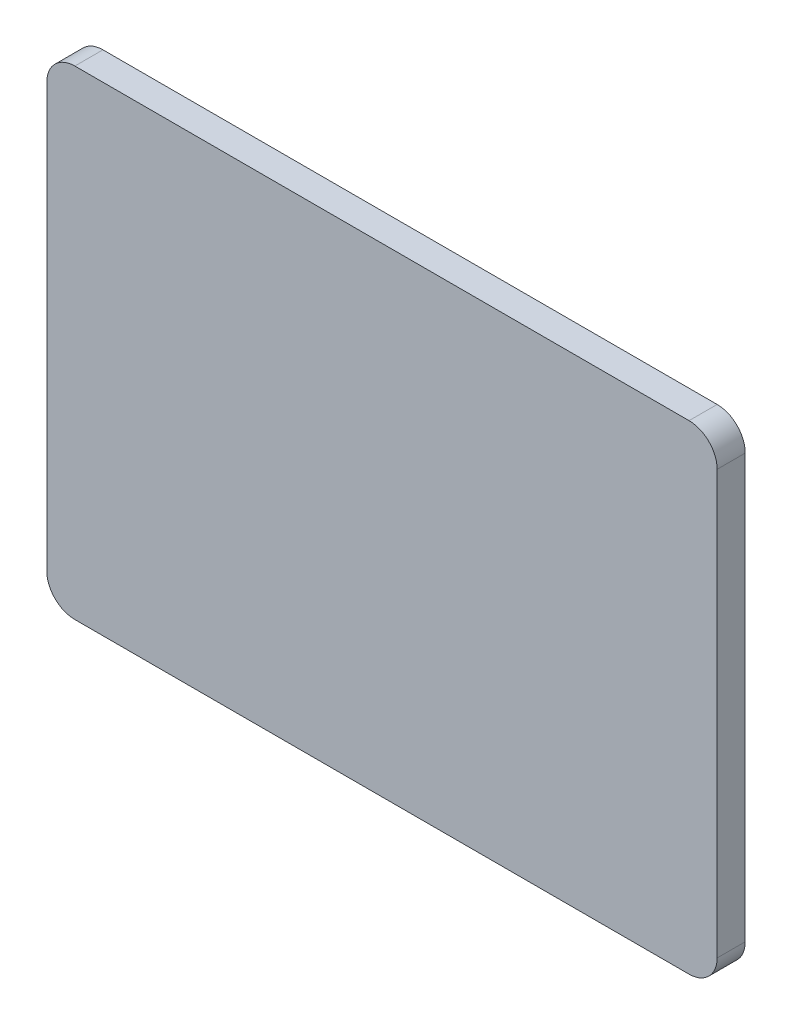
ISO-10303-21;
HEADER;
FILE_DESCRIPTION(('STEP AP214'),'2;1');
FILE_NAME('part.step','',(''),(''),'','','');
FILE_SCHEMA(('AUTOMOTIVE_DESIGN { 1 0 10303 214 1 1 1 1 }'));
ENDSEC;
DATA;
#1=APPLICATION_CONTEXT('core data for automotive mechanical design processes');
#2=APPLICATION_PROTOCOL_DEFINITION('international standard','automotive_design',2000,#1);
#3=PRODUCT_CONTEXT('',#1,'mechanical');
#4=PRODUCT('Part','Part','',(#3));
#5=PRODUCT_RELATED_PRODUCT_CATEGORY('part','',(#4));
#6=PRODUCT_DEFINITION_FORMATION('','',#4);
#7=PRODUCT_DEFINITION_CONTEXT('part definition',#1,'design');
#8=PRODUCT_DEFINITION('design','',#6,#7);
#9=PRODUCT_DEFINITION_SHAPE('','',#8);
#10=(LENGTH_UNIT() NAMED_UNIT(*) SI_UNIT(.MILLI.,.METRE.));
#11=(NAMED_UNIT(*) PLANE_ANGLE_UNIT() SI_UNIT($,.RADIAN.));
#12=(NAMED_UNIT(*) SI_UNIT($,.STERADIAN.) SOLID_ANGLE_UNIT());
#13=UNCERTAINTY_MEASURE_WITH_UNIT(LENGTH_MEASURE(1.E-05),#10,'distance_accuracy_value','');
#14=(GEOMETRIC_REPRESENTATION_CONTEXT(3) GLOBAL_UNCERTAINTY_ASSIGNED_CONTEXT((#13)) GLOBAL_UNIT_ASSIGNED_CONTEXT((#10,
#11,#12)) REPRESENTATION_CONTEXT('',''));
#15=CARTESIAN_POINT('',(0.,0.,0.));
#16=DIRECTION('',(0.,0.,1.));
#17=DIRECTION('',(1.,0.,0.));
#18=AXIS2_PLACEMENT_3D('',#15,#16,#17);
#19=CARTESIAN_POINT('',(0.,0.,15.));
#20=DIRECTION('',(1.,0.,0.));
#21=DIRECTION('',(0.,0.,-1.));
#22=AXIS2_PLACEMENT_3D('',#19,#20,#21);
#23=PLANE('',#22);
#24=DIRECTION('',(0.,-1.,0.));
#25=VECTOR('',#24,1.);
#26=CARTESIAN_POINT('',(0.,0.,0.));
#27=LINE('',#26,#25);
#28=CARTESIAN_POINT('',(0.,241.,0.));
#29=VERTEX_POINT('',#28);
#30=CARTESIAN_POINT('',(0.,15.,0.));
#31=VERTEX_POINT('',#30);
#32=EDGE_CURVE('E126',#29,#31,#27,.T.);
#33=ORIENTED_EDGE('',*,*,#32,.T.);
#34=DIRECTION('',(0.,0.,-1.));
#35=VECTOR('',#34,1.);
#36=CARTESIAN_POINT('',(0.,15.,15.));
#37=LINE('',#36,#35);
#38=CARTESIAN_POINT('',(0.,15.,15.));
#39=VERTEX_POINT('',#38);
#40=EDGE_CURVE('E104',#31,#39,#37,.F.);
#41=ORIENTED_EDGE('',*,*,#40,.T.);
#42=DIRECTION('',(0.,-1.,0.));
#43=VECTOR('',#42,1.);
#44=CARTESIAN_POINT('',(0.,0.,15.));
#45=LINE('',#44,#43);
#46=CARTESIAN_POINT('',(0.,241.,15.));
#47=VERTEX_POINT('',#46);
#48=EDGE_CURVE('E135',#47,#39,#45,.T.);
#49=ORIENTED_EDGE('',*,*,#48,.F.);
#50=DIRECTION('',(0.,0.,-1.));
#51=VECTOR('',#50,1.);
#52=CARTESIAN_POINT('',(0.,241.,15.));
#53=LINE('',#52,#51);
#54=EDGE_CURVE('E109',#47,#29,#53,.T.);
#55=ORIENTED_EDGE('',*,*,#54,.T.);
#56=EDGE_LOOP('',(#33,#41,#49,#55));
#57=FACE_BOUND('',#56,.T.);
#58=ADVANCED_FACE('F33',(#57),#23,.F.);
#59=CARTESIAN_POINT('',(0.,0.,15.));
#60=DIRECTION('',(0.,1.,0.));
#61=DIRECTION('',(0.,0.,1.));
#62=AXIS2_PLACEMENT_3D('',#59,#60,#61);
#63=PLANE('',#62);
#64=DIRECTION('',(1.,0.,0.));
#65=VECTOR('',#64,1.);
#66=CARTESIAN_POINT('',(0.,0.,15.));
#67=LINE('',#66,#65);
#68=CARTESIAN_POINT('',(15.,0.,15.));
#69=VERTEX_POINT('',#68);
#70=CARTESIAN_POINT('',(343.,0.,15.));
#71=VERTEX_POINT('',#70);
#72=EDGE_CURVE('E119',#69,#71,#67,.T.);
#73=ORIENTED_EDGE('',*,*,#72,.F.);
#74=DIRECTION('',(0.,0.,-1.));
#75=VECTOR('',#74,1.);
#76=CARTESIAN_POINT('',(15.,0.,15.));
#77=LINE('',#76,#75);
#78=CARTESIAN_POINT('',(15.,0.,0.));
#79=VERTEX_POINT('',#78);
#80=EDGE_CURVE('E103',#69,#79,#77,.T.);
#81=ORIENTED_EDGE('',*,*,#80,.T.);
#82=DIRECTION('',(1.,0.,0.));
#83=VECTOR('',#82,1.);
#84=CARTESIAN_POINT('',(0.,0.,0.));
#85=LINE('',#84,#83);
#86=CARTESIAN_POINT('',(343.,0.,0.));
#87=VERTEX_POINT('',#86);
#88=EDGE_CURVE('E116',#79,#87,#85,.T.);
#89=ORIENTED_EDGE('',*,*,#88,.T.);
#90=DIRECTION('',(0.,0.,-1.));
#91=VECTOR('',#90,1.);
#92=CARTESIAN_POINT('',(343.,0.,15.));
#93=LINE('',#92,#91);
#94=EDGE_CURVE('E121',#87,#71,#93,.F.);
#95=ORIENTED_EDGE('',*,*,#94,.T.);
#96=EDGE_LOOP('',(#73,#81,#89,#95));
#97=FACE_BOUND('',#96,.T.);
#98=ADVANCED_FACE('F115',(#97),#63,.F.);
#99=CARTESIAN_POINT('',(358.,0.,15.));
#100=DIRECTION('',(-1.,0.,0.));
#101=DIRECTION('',(0.,0.,1.));
#102=AXIS2_PLACEMENT_3D('',#99,#100,#101);
#103=PLANE('',#102);
#104=DIRECTION('',(0.,1.,0.));
#105=VECTOR('',#104,1.);
#106=CARTESIAN_POINT('',(358.,0.,15.));
#107=LINE('',#106,#105);
#108=CARTESIAN_POINT('',(358.,15.,15.));
#109=VERTEX_POINT('',#108);
#110=CARTESIAN_POINT('',(358.,241.,15.));
#111=VERTEX_POINT('',#110);
#112=EDGE_CURVE('E161',#109,#111,#107,.T.);
#113=ORIENTED_EDGE('',*,*,#112,.F.);
#114=DIRECTION('',(0.,0.,-1.));
#115=VECTOR('',#114,1.);
#116=CARTESIAN_POINT('',(358.,15.,15.));
#117=LINE('',#116,#115);
#118=CARTESIAN_POINT('',(358.,15.,0.));
#119=VERTEX_POINT('',#118);
#120=EDGE_CURVE('E154',#109,#119,#117,.T.);
#121=ORIENTED_EDGE('',*,*,#120,.T.);
#122=DIRECTION('',(0.,1.,0.));
#123=VECTOR('',#122,1.);
#124=CARTESIAN_POINT('',(358.,0.,0.));
#125=LINE('',#124,#123);
#126=CARTESIAN_POINT('',(358.,241.,0.));
#127=VERTEX_POINT('',#126);
#128=EDGE_CURVE('E125',#119,#127,#125,.T.);
#129=ORIENTED_EDGE('',*,*,#128,.T.);
#130=DIRECTION('',(0.,0.,-1.));
#131=VECTOR('',#130,1.);
#132=CARTESIAN_POINT('',(358.,241.,15.));
#133=LINE('',#132,#131);
#134=EDGE_CURVE('E152',#127,#111,#133,.F.);
#135=ORIENTED_EDGE('',*,*,#134,.T.);
#136=EDGE_LOOP('',(#113,#121,#129,#135));
#137=FACE_BOUND('',#136,.T.);
#138=ADVANCED_FACE('F159',(#137),#103,.F.);
#139=CARTESIAN_POINT('',(0.,256.,15.));
#140=DIRECTION('',(0.,-1.,0.));
#141=DIRECTION('',(0.,0.,-1.));
#142=AXIS2_PLACEMENT_3D('',#139,#140,#141);
#143=PLANE('',#142);
#144=DIRECTION('',(-1.,0.,0.));
#145=VECTOR('',#144,1.);
#146=CARTESIAN_POINT('',(0.,256.,15.));
#147=LINE('',#146,#145);
#148=CARTESIAN_POINT('',(343.,256.,15.));
#149=VERTEX_POINT('',#148);
#150=CARTESIAN_POINT('',(15.,256.,15.));
#151=VERTEX_POINT('',#150);
#152=EDGE_CURVE('E136',#149,#151,#147,.T.);
#153=ORIENTED_EDGE('',*,*,#152,.F.);
#154=DIRECTION('',(0.,0.,-1.));
#155=VECTOR('',#154,1.);
#156=CARTESIAN_POINT('',(343.,256.,15.));
#157=LINE('',#156,#155);
#158=CARTESIAN_POINT('',(343.,256.,0.));
#159=VERTEX_POINT('',#158);
#160=EDGE_CURVE('E11',#149,#159,#157,.T.);
#161=ORIENTED_EDGE('',*,*,#160,.T.);
#162=DIRECTION('',(-1.,0.,0.));
#163=VECTOR('',#162,1.);
#164=CARTESIAN_POINT('',(0.,256.,0.));
#165=LINE('',#164,#163);
#166=CARTESIAN_POINT('',(15.,256.,0.));
#167=VERTEX_POINT('',#166);
#168=EDGE_CURVE('E129',#159,#167,#165,.T.);
#169=ORIENTED_EDGE('',*,*,#168,.T.);
#170=DIRECTION('',(0.,0.,-1.));
#171=VECTOR('',#170,1.);
#172=CARTESIAN_POINT('',(15.,256.,15.));
#173=LINE('',#172,#171);
#174=EDGE_CURVE('E41',#167,#151,#173,.F.);
#175=ORIENTED_EDGE('',*,*,#174,.T.);
#176=EDGE_LOOP('',(#153,#161,#169,#175));
#177=FACE_BOUND('',#176,.T.);
#178=ADVANCED_FACE('F168',(#177),#143,.F.);
#179=CARTESIAN_POINT('',(0.,0.,15.));
#180=DIRECTION('',(0.,0.,-1.));
#181=DIRECTION('',(-1.,0.,0.));
#182=AXIS2_PLACEMENT_3D('',#179,#180,#181);
#183=PLANE('',#182);
#184=ORIENTED_EDGE('',*,*,#48,.T.);
#185=CARTESIAN_POINT('',(15.,15.,15.));
#186=DIRECTION('',(0.,0.,-1.));
#187=DIRECTION('',(-1.,0.,0.));
#188=AXIS2_PLACEMENT_3D('',#185,#186,#187);
#189=CIRCLE('',#188,15.);
#190=EDGE_CURVE('E150',#39,#69,#189,.F.);
#191=ORIENTED_EDGE('',*,*,#190,.T.);
#192=ORIENTED_EDGE('',*,*,#72,.T.);
#193=CARTESIAN_POINT('',(343.,15.,15.));
#194=DIRECTION('',(0.,0.,-1.));
#195=DIRECTION('',(-1.,0.,0.));
#196=AXIS2_PLACEMENT_3D('',#193,#194,#195);
#197=CIRCLE('',#196,15.);
#198=EDGE_CURVE('E148',#71,#109,#197,.F.);
#199=ORIENTED_EDGE('',*,*,#198,.T.);
#200=ORIENTED_EDGE('',*,*,#112,.T.);
#201=CARTESIAN_POINT('',(343.,241.,15.));
#202=DIRECTION('',(0.,0.,-1.));
#203=DIRECTION('',(-1.,0.,0.));
#204=AXIS2_PLACEMENT_3D('',#201,#202,#203);
#205=CIRCLE('',#204,15.);
#206=EDGE_CURVE('E54',#111,#149,#205,.F.);
#207=ORIENTED_EDGE('',*,*,#206,.T.);
#208=ORIENTED_EDGE('',*,*,#152,.T.);
#209=CARTESIAN_POINT('',(15.,241.,15.));
#210=DIRECTION('',(0.,0.,-1.));
#211=DIRECTION('',(-1.,0.,0.));
#212=AXIS2_PLACEMENT_3D('',#209,#210,#211);
#213=CIRCLE('',#212,15.);
#214=EDGE_CURVE('E145',#151,#47,#213,.F.);
#215=ORIENTED_EDGE('',*,*,#214,.T.);
#216=EDGE_LOOP('',(#184,#191,#192,#199,#200,#207,#208,#215));
#217=FACE_BOUND('',#216,.T.);
#218=ADVANCED_FACE('F175',(#217),#183,.F.);
#219=CARTESIAN_POINT('',(0.,0.,0.));
#220=DIRECTION('',(0.,0.,-1.));
#221=DIRECTION('',(-1.,0.,0.));
#222=AXIS2_PLACEMENT_3D('',#219,#220,#221);
#223=PLANE('',#222);
#224=ORIENTED_EDGE('',*,*,#88,.F.);
#225=CARTESIAN_POINT('',(15.,15.,0.));
#226=DIRECTION('',(0.,0.,-1.));
#227=DIRECTION('',(-1.,0.,0.));
#228=AXIS2_PLACEMENT_3D('',#225,#226,#227);
#229=CIRCLE('',#228,15.);
#230=EDGE_CURVE('E99',#79,#31,#229,.T.);
#231=ORIENTED_EDGE('',*,*,#230,.T.);
#232=ORIENTED_EDGE('',*,*,#32,.F.);
#233=CARTESIAN_POINT('',(15.,241.,0.));
#234=DIRECTION('',(0.,0.,-1.));
#235=DIRECTION('',(-1.,0.,0.));
#236=AXIS2_PLACEMENT_3D('',#233,#234,#235);
#237=CIRCLE('',#236,15.);
#238=EDGE_CURVE('E120',#29,#167,#237,.T.);
#239=ORIENTED_EDGE('',*,*,#238,.T.);
#240=ORIENTED_EDGE('',*,*,#168,.F.);
#241=CARTESIAN_POINT('',(343.,241.,0.));
#242=DIRECTION('',(0.,0.,-1.));
#243=DIRECTION('',(-1.,0.,0.));
#244=AXIS2_PLACEMENT_3D('',#241,#242,#243);
#245=CIRCLE('',#244,15.);
#246=EDGE_CURVE('E139',#159,#127,#245,.T.);
#247=ORIENTED_EDGE('',*,*,#246,.T.);
#248=ORIENTED_EDGE('',*,*,#128,.F.);
#249=CARTESIAN_POINT('',(343.,15.,0.));
#250=DIRECTION('',(0.,0.,-1.));
#251=DIRECTION('',(-1.,0.,0.));
#252=AXIS2_PLACEMENT_3D('',#249,#250,#251);
#253=CIRCLE('',#252,15.);
#254=EDGE_CURVE('E110',#119,#87,#253,.T.);
#255=ORIENTED_EDGE('',*,*,#254,.T.);
#256=EDGE_LOOP('',(#224,#231,#232,#239,#240,#247,#248,#255));
#257=FACE_BOUND('',#256,.T.);
#258=ADVANCED_FACE('F123',(#257),#223,.T.);
#259=CARTESIAN_POINT('',(15.,15.,15.));
#260=DIRECTION('',(0.,0.,-1.));
#261=DIRECTION('',(-1.,0.,0.));
#262=AXIS2_PLACEMENT_3D('',#259,#260,#261);
#263=CYLINDRICAL_SURFACE('',#262,15.);
#264=ORIENTED_EDGE('',*,*,#190,.F.);
#265=ORIENTED_EDGE('',*,*,#40,.F.);
#266=ORIENTED_EDGE('',*,*,#230,.F.);
#267=ORIENTED_EDGE('',*,*,#80,.F.);
#268=EDGE_LOOP('',(#264,#265,#266,#267));
#269=FACE_BOUND('',#268,.T.);
#270=ADVANCED_FACE('F102',(#269),#263,.T.);
#271=CARTESIAN_POINT('',(343.,15.,15.));
#272=DIRECTION('',(0.,0.,-1.));
#273=DIRECTION('',(-1.,0.,0.));
#274=AXIS2_PLACEMENT_3D('',#271,#272,#273);
#275=CYLINDRICAL_SURFACE('',#274,15.);
#276=ORIENTED_EDGE('',*,*,#198,.F.);
#277=ORIENTED_EDGE('',*,*,#94,.F.);
#278=ORIENTED_EDGE('',*,*,#254,.F.);
#279=ORIENTED_EDGE('',*,*,#120,.F.);
#280=EDGE_LOOP('',(#276,#277,#278,#279));
#281=FACE_BOUND('',#280,.T.);
#282=ADVANCED_FACE('F183',(#281),#275,.T.);
#283=CARTESIAN_POINT('',(343.,241.,15.));
#284=DIRECTION('',(0.,0.,-1.));
#285=DIRECTION('',(-1.,0.,0.));
#286=AXIS2_PLACEMENT_3D('',#283,#284,#285);
#287=CYLINDRICAL_SURFACE('',#286,15.);
#288=ORIENTED_EDGE('',*,*,#206,.F.);
#289=ORIENTED_EDGE('',*,*,#134,.F.);
#290=ORIENTED_EDGE('',*,*,#246,.F.);
#291=ORIENTED_EDGE('',*,*,#160,.F.);
#292=EDGE_LOOP('',(#288,#289,#290,#291));
#293=FACE_BOUND('',#292,.T.);
#294=ADVANCED_FACE('F167',(#293),#287,.T.);
#295=CARTESIAN_POINT('',(15.,241.,15.));
#296=DIRECTION('',(0.,0.,-1.));
#297=DIRECTION('',(-1.,0.,0.));
#298=AXIS2_PLACEMENT_3D('',#295,#296,#297);
#299=CYLINDRICAL_SURFACE('',#298,15.);
#300=ORIENTED_EDGE('',*,*,#214,.F.);
#301=ORIENTED_EDGE('',*,*,#174,.F.);
#302=ORIENTED_EDGE('',*,*,#238,.F.);
#303=ORIENTED_EDGE('',*,*,#54,.F.);
#304=EDGE_LOOP('',(#300,#301,#302,#303));
#305=FACE_BOUND('',#304,.T.);
#306=ADVANCED_FACE('F35',(#305),#299,.T.);
#307=CLOSED_SHELL('',(#58,#98,#138,#178,#218,#258,#270,#282,#294,#306));
#308=MANIFOLD_SOLID_BREP('B2',#307);
#309=ADVANCED_BREP_SHAPE_REPRESENTATION('',(#18,#308),#14);
#310=SHAPE_DEFINITION_REPRESENTATION(#9,#309);
ENDSEC;
END-ISO-10303-21;
